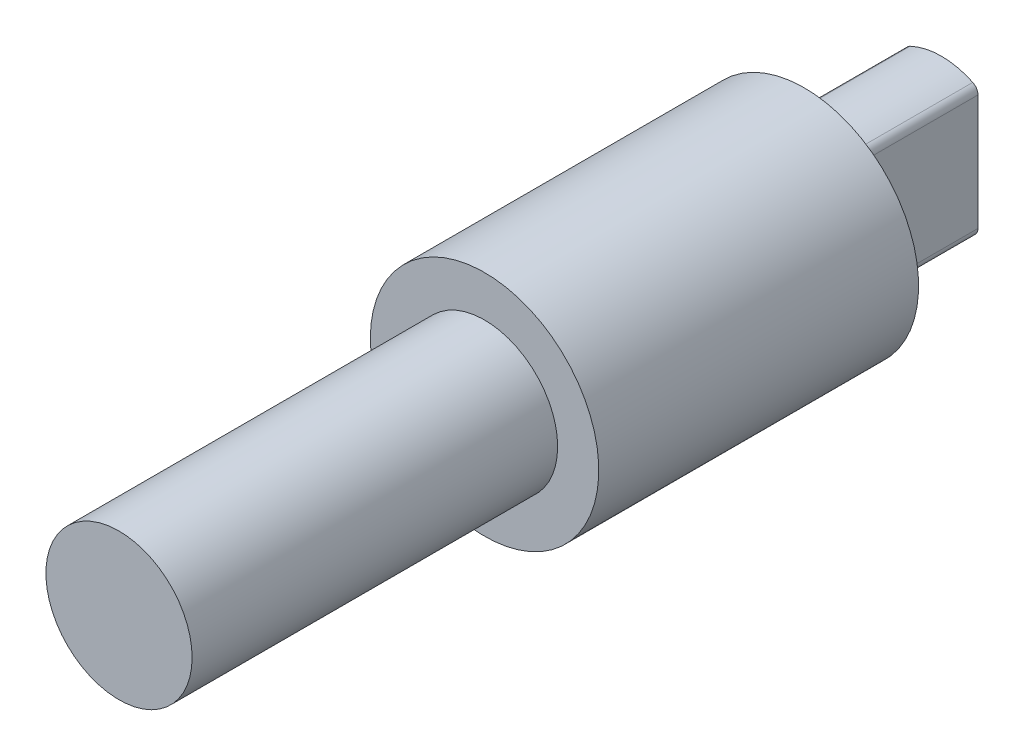
ISO-10303-21;
HEADER;
FILE_DESCRIPTION(('STEP AP214'),'2;1');
FILE_NAME('part.step','',(''),(''),'','','');
FILE_SCHEMA(('AUTOMOTIVE_DESIGN { 1 0 10303 214 1 1 1 1 }'));
ENDSEC;
DATA;
#1=APPLICATION_CONTEXT('core data for automotive mechanical design processes');
#2=APPLICATION_PROTOCOL_DEFINITION('international standard','automotive_design',2000,#1);
#3=PRODUCT_CONTEXT('',#1,'mechanical');
#4=PRODUCT('Part','Part','',(#3));
#5=PRODUCT_RELATED_PRODUCT_CATEGORY('part','',(#4));
#6=PRODUCT_DEFINITION_FORMATION('','',#4);
#7=PRODUCT_DEFINITION_CONTEXT('part definition',#1,'design');
#8=PRODUCT_DEFINITION('design','',#6,#7);
#9=PRODUCT_DEFINITION_SHAPE('','',#8);
#10=(LENGTH_UNIT() NAMED_UNIT(*) SI_UNIT(.MILLI.,.METRE.));
#11=(NAMED_UNIT(*) PLANE_ANGLE_UNIT() SI_UNIT($,.RADIAN.));
#12=(NAMED_UNIT(*) SI_UNIT($,.STERADIAN.) SOLID_ANGLE_UNIT());
#13=UNCERTAINTY_MEASURE_WITH_UNIT(LENGTH_MEASURE(1.E-05),#10,'distance_accuracy_value','');
#14=(GEOMETRIC_REPRESENTATION_CONTEXT(3) GLOBAL_UNCERTAINTY_ASSIGNED_CONTEXT((#13)) GLOBAL_UNIT_ASSIGNED_CONTEXT((#10,
#11,#12)) REPRESENTATION_CONTEXT('',''));
#15=CARTESIAN_POINT('',(0.,0.,0.));
#16=DIRECTION('',(0.,0.,1.));
#17=DIRECTION('',(1.,0.,0.));
#18=AXIS2_PLACEMENT_3D('',#15,#16,#17);
#19=CARTESIAN_POINT('',(0.,0.,-364.100348116694));
#20=DIRECTION('',(0.,0.,-1.));
#21=DIRECTION('',(-1.,0.,0.));
#22=AXIS2_PLACEMENT_3D('',#19,#20,#21);
#23=CYLINDRICAL_SURFACE('',#22,8.);
#24=CARTESIAN_POINT('',(0.,0.,-25.));
#25=DIRECTION('',(0.,0.,-1.));
#26=DIRECTION('',(-1.,0.,0.));
#27=AXIS2_PLACEMENT_3D('',#24,#25,#26);
#28=CIRCLE('',#27,8.);
#29=CARTESIAN_POINT('',(-3.42857142857143,7.22806322324201,-25.));
#30=VERTEX_POINT('',#29);
#31=CARTESIAN_POINT('',(3.42857142857142,7.22806322324201,-25.));
#32=VERTEX_POINT('',#31);
#33=EDGE_CURVE('E163',#30,#32,#28,.T.);
#34=ORIENTED_EDGE('',*,*,#33,.T.);
#35=DIRECTION('',(0.,0.,-1.));
#36=VECTOR('',#35,1.);
#37=CARTESIAN_POINT('',(3.42857142857138,7.22806322324201,-364.100348116694));
#38=LINE('',#37,#36);
#39=CARTESIAN_POINT('',(3.42857142857142,7.22806322324202,-40.));
#40=VERTEX_POINT('',#39);
#41=EDGE_CURVE('E174',#32,#40,#38,.T.);
#42=ORIENTED_EDGE('',*,*,#41,.T.);
#43=CARTESIAN_POINT('',(0.,0.,-40.));
#44=DIRECTION('',(0.,0.,-1.));
#45=DIRECTION('',(-1.,0.,0.));
#46=AXIS2_PLACEMENT_3D('',#43,#44,#45);
#47=CIRCLE('',#46,8.00000000000001);
#48=CARTESIAN_POINT('',(-3.42857142857144,7.22806322324202,-40.));
#49=VERTEX_POINT('',#48);
#50=EDGE_CURVE('E160',#49,#40,#47,.T.);
#51=ORIENTED_EDGE('',*,*,#50,.F.);
#52=DIRECTION('',(0.,0.,-1.));
#53=VECTOR('',#52,1.);
#54=CARTESIAN_POINT('',(-3.42857142857148,7.22806322324201,-364.100348116694));
#55=LINE('',#54,#53);
#56=EDGE_CURVE('E172',#49,#30,#55,.F.);
#57=ORIENTED_EDGE('',*,*,#56,.T.);
#58=EDGE_LOOP('',(#34,#42,#51,#57));
#59=FACE_BOUND('',#58,.T.);
#60=ADVANCED_FACE('F32',(#59),#23,.T.);
#61=CARTESIAN_POINT('',(0.,0.,-364.100348116694));
#62=DIRECTION('',(0.,0.,-1.));
#63=DIRECTION('',(-1.,0.,0.));
#64=AXIS2_PLACEMENT_3D('',#61,#62,#63);
#65=CYLINDRICAL_SURFACE('',#64,8.);
#66=DIRECTION('',(0.,0.,1.));
#67=VECTOR('',#66,1.);
#68=CARTESIAN_POINT('',(-7.87831834848021,1.39,10.));
#69=LINE('',#68,#67);
#70=CARTESIAN_POINT('',(-7.87831834848021,1.39,10.));
#71=VERTEX_POINT('',#70);
#72=CARTESIAN_POINT('',(-7.87831834848021,1.39,40.));
#73=VERTEX_POINT('',#72);
#74=EDGE_CURVE('E142',#71,#73,#69,.T.);
#75=ORIENTED_EDGE('',*,*,#74,.T.);
#76=CARTESIAN_POINT('',(0.,0.,40.));
#77=DIRECTION('',(0.,0.,1.));
#78=DIRECTION('',(1.,0.,0.));
#79=AXIS2_PLACEMENT_3D('',#76,#77,#78);
#80=CIRCLE('',#79,8.);
#81=CARTESIAN_POINT('',(-7.87831834848023,-1.39,40.));
#82=VERTEX_POINT('',#81);
#83=EDGE_CURVE('E123',#73,#82,#80,.T.);
#84=ORIENTED_EDGE('',*,*,#83,.T.);
#85=DIRECTION('',(0.,0.,1.));
#86=VECTOR('',#85,1.);
#87=CARTESIAN_POINT('',(-7.87831834848021,-1.39,10.));
#88=LINE('',#87,#86);
#89=CARTESIAN_POINT('',(-7.87831834848021,-1.39,10.));
#90=VERTEX_POINT('',#89);
#91=EDGE_CURVE('E139',#90,#82,#88,.T.);
#92=ORIENTED_EDGE('',*,*,#91,.F.);
#93=CARTESIAN_POINT('',(0.,0.,10.));
#94=DIRECTION('',(0.,0.,-1.));
#95=DIRECTION('',(-1.,0.,0.));
#96=AXIS2_PLACEMENT_3D('',#93,#94,#95);
#97=CIRCLE('',#96,8.);
#98=EDGE_CURVE('E170',#71,#90,#97,.T.);
#99=ORIENTED_EDGE('',*,*,#98,.F.);
#100=EDGE_LOOP('',(#75,#84,#92,#99));
#101=FACE_BOUND('',#100,.T.);
#102=CARTESIAN_POINT('',(0.,0.,50.));
#103=DIRECTION('',(0.,0.,1.));
#104=DIRECTION('',(1.,0.,0.));
#105=AXIS2_PLACEMENT_3D('',#102,#103,#104);
#106=CIRCLE('',#105,8.);
#107=CARTESIAN_POINT('',(7.99999999999999,0.,50.));
#108=VERTEX_POINT('',#107);
#109=EDGE_CURVE('E143',#108,#108,#106,.T.);
#110=ORIENTED_EDGE('',*,*,#109,.F.);
#111=EDGE_LOOP('',(#110));
#112=FACE_BOUND('',#111,.T.);
#113=ADVANCED_FACE('F136',(#101,#112),#65,.T.);
#114=CARTESIAN_POINT('',(12.5,0.,10.));
#115=DIRECTION('',(0.,0.,-1.));
#116=DIRECTION('',(-1.,0.,0.));
#117=AXIS2_PLACEMENT_3D('',#114,#115,#116);
#118=PLANE('',#117);
#119=CARTESIAN_POINT('',(0.,0.,10.));
#120=DIRECTION('',(0.,0.,-1.));
#121=DIRECTION('',(-1.,0.,0.));
#122=AXIS2_PLACEMENT_3D('',#119,#120,#121);
#123=CIRCLE('',#122,12.5);
#124=CARTESIAN_POINT('',(-12.5,0.,10.));
#125=VERTEX_POINT('',#124);
#126=EDGE_CURVE('E167',#125,#125,#123,.T.);
#127=ORIENTED_EDGE('',*,*,#126,.F.);
#128=EDGE_LOOP('',(#127));
#129=FACE_BOUND('',#128,.T.);
#130=ORIENTED_EDGE('',*,*,#98,.T.);
#131=DIRECTION('',(1.,0.,0.));
#132=VECTOR('',#131,1.);
#133=CARTESIAN_POINT('',(-6.61,-1.39,10.));
#134=LINE('',#133,#132);
#135=CARTESIAN_POINT('',(-6.61,-1.39,10.));
#136=VERTEX_POINT('',#135);
#137=EDGE_CURVE('E148',#90,#136,#134,.T.);
#138=ORIENTED_EDGE('',*,*,#137,.T.);
#139=DIRECTION('',(0.,1.,0.));
#140=VECTOR('',#139,1.);
#141=CARTESIAN_POINT('',(-6.61,1.39,10.));
#142=LINE('',#141,#140);
#143=CARTESIAN_POINT('',(-6.61,1.39,10.));
#144=VERTEX_POINT('',#143);
#145=EDGE_CURVE('E130',#136,#144,#142,.T.);
#146=ORIENTED_EDGE('',*,*,#145,.T.);
#147=DIRECTION('',(-1.,0.,0.));
#148=VECTOR('',#147,1.);
#149=CARTESIAN_POINT('',(-6.61,1.39,10.));
#150=LINE('',#149,#148);
#151=EDGE_CURVE('E250',#144,#71,#150,.T.);
#152=ORIENTED_EDGE('',*,*,#151,.T.);
#153=EDGE_LOOP('',(#130,#138,#146,#152));
#154=FACE_BOUND('',#153,.T.);
#155=ADVANCED_FACE('F261',(#129,#154),#118,.F.);
#156=CARTESIAN_POINT('',(0.,0.,-364.100348116694));
#157=DIRECTION('',(0.,0.,-1.));
#158=DIRECTION('',(-1.,0.,0.));
#159=AXIS2_PLACEMENT_3D('',#156,#157,#158);
#160=CYLINDRICAL_SURFACE('',#159,12.5);
#161=CARTESIAN_POINT('',(0.,0.,-25.));
#162=DIRECTION('',(0.,0.,-1.));
#163=DIRECTION('',(-1.,0.,0.));
#164=AXIS2_PLACEMENT_3D('',#161,#162,#163);
#165=CIRCLE('',#164,12.5);
#166=CARTESIAN_POINT('',(-12.5,0.,-25.));
#167=VERTEX_POINT('',#166);
#168=EDGE_CURVE('E164',#167,#167,#165,.T.);
#169=ORIENTED_EDGE('',*,*,#168,.F.);
#170=EDGE_LOOP('',(#169));
#171=FACE_BOUND('',#170,.T.);
#172=ORIENTED_EDGE('',*,*,#126,.T.);
#173=EDGE_LOOP('',(#172));
#174=FACE_BOUND('',#173,.T.);
#175=ADVANCED_FACE('F263',(#171,#174),#160,.T.);
#176=CARTESIAN_POINT('',(12.5,0.,-25.));
#177=DIRECTION('',(0.,0.,1.));
#178=DIRECTION('',(1.,0.,0.));
#179=AXIS2_PLACEMENT_3D('',#176,#177,#178);
#180=PLANE('',#179);
#181=ORIENTED_EDGE('',*,*,#33,.F.);
#182=CARTESIAN_POINT('',(-3.,6.32455532033676,-25.));
#183=DIRECTION('',(0.,0.,1.));
#184=DIRECTION('',(1.,0.,0.));
#185=AXIS2_PLACEMENT_3D('',#182,#183,#184);
#186=CIRCLE('',#185,1.);
#187=CARTESIAN_POINT('',(-4.,6.32455532033676,-25.));
#188=VERTEX_POINT('',#187);
#189=EDGE_CURVE('E201',#30,#188,#186,.T.);
#190=ORIENTED_EDGE('',*,*,#189,.T.);
#191=DIRECTION('',(0.,-1.,0.));
#192=VECTOR('',#191,1.);
#193=CARTESIAN_POINT('',(-4.,6.92820323027552,-25.));
#194=LINE('',#193,#192);
#195=CARTESIAN_POINT('',(-4.,-6.32455532033676,-25.));
#196=VERTEX_POINT('',#195);
#197=EDGE_CURVE('E207',#188,#196,#194,.T.);
#198=ORIENTED_EDGE('',*,*,#197,.T.);
#199=CARTESIAN_POINT('',(-3.,-6.32455532033676,-25.));
#200=DIRECTION('',(0.,0.,1.));
#201=DIRECTION('',(1.,0.,0.));
#202=AXIS2_PLACEMENT_3D('',#199,#200,#201);
#203=CIRCLE('',#202,1.);
#204=CARTESIAN_POINT('',(-3.42857142857143,-7.22806322324201,-25.));
#205=VERTEX_POINT('',#204);
#206=EDGE_CURVE('E40',#196,#205,#203,.T.);
#207=ORIENTED_EDGE('',*,*,#206,.T.);
#208=CARTESIAN_POINT('',(3.42857142857142,-7.22806322324201,-25.));
#209=VERTEX_POINT('',#208);
#210=EDGE_CURVE('E161',#209,#205,#28,.T.);
#211=ORIENTED_EDGE('',*,*,#210,.F.);
#212=CARTESIAN_POINT('',(3.,-6.32455532033676,-25.));
#213=DIRECTION('',(0.,0.,1.));
#214=DIRECTION('',(1.,0.,0.));
#215=AXIS2_PLACEMENT_3D('',#212,#213,#214);
#216=CIRCLE('',#215,1.);
#217=CARTESIAN_POINT('',(4.,-6.32455532033676,-25.));
#218=VERTEX_POINT('',#217);
#219=EDGE_CURVE('E11',#209,#218,#216,.T.);
#220=ORIENTED_EDGE('',*,*,#219,.T.);
#221=DIRECTION('',(0.,1.,0.));
#222=VECTOR('',#221,1.);
#223=CARTESIAN_POINT('',(4.,6.92820323027551,-25.));
#224=LINE('',#223,#222);
#225=CARTESIAN_POINT('',(4.,6.32455532033676,-25.));
#226=VERTEX_POINT('',#225);
#227=EDGE_CURVE('E144',#218,#226,#224,.T.);
#228=ORIENTED_EDGE('',*,*,#227,.T.);
#229=CARTESIAN_POINT('',(3.,6.32455532033676,-25.));
#230=DIRECTION('',(0.,0.,1.));
#231=DIRECTION('',(1.,0.,0.));
#232=AXIS2_PLACEMENT_3D('',#229,#230,#231);
#233=CIRCLE('',#232,1.);
#234=EDGE_CURVE('E199',#226,#32,#233,.T.);
#235=ORIENTED_EDGE('',*,*,#234,.T.);
#236=EDGE_LOOP('',(#181,#190,#198,#207,#211,#220,#228,#235));
#237=FACE_BOUND('',#236,.T.);
#238=ORIENTED_EDGE('',*,*,#168,.T.);
#239=EDGE_LOOP('',(#238));
#240=FACE_BOUND('',#239,.T.);
#241=ADVANCED_FACE('F205',(#237,#240),#180,.F.);
#242=ORIENTED_EDGE('',*,*,#210,.T.);
#243=DIRECTION('',(0.,0.,-1.));
#244=VECTOR('',#243,1.);
#245=CARTESIAN_POINT('',(-3.42857142857148,-7.22806322324201,-364.100348116694));
#246=LINE('',#245,#244);
#247=CARTESIAN_POINT('',(-3.42857142857144,-7.22806322324202,-40.));
#248=VERTEX_POINT('',#247);
#249=EDGE_CURVE('E196',#205,#248,#246,.T.);
#250=ORIENTED_EDGE('',*,*,#249,.T.);
#251=CARTESIAN_POINT('',(3.42857142857142,-7.22806322324202,-40.));
#252=VERTEX_POINT('',#251);
#253=EDGE_CURVE('E151',#252,#248,#47,.T.);
#254=ORIENTED_EDGE('',*,*,#253,.F.);
#255=DIRECTION('',(0.,0.,-1.));
#256=VECTOR('',#255,1.);
#257=CARTESIAN_POINT('',(3.42857142857138,-7.22806322324201,-364.100348116694));
#258=LINE('',#257,#256);
#259=EDGE_CURVE('E53',#252,#209,#258,.F.);
#260=ORIENTED_EDGE('',*,*,#259,.T.);
#261=EDGE_LOOP('',(#242,#250,#254,#260));
#262=FACE_BOUND('',#261,.T.);
#263=ADVANCED_FACE('F276',(#262),#23,.T.);
#264=CARTESIAN_POINT('',(8.,0.,-40.));
#265=DIRECTION('',(0.,0.,1.));
#266=DIRECTION('',(1.,0.,0.));
#267=AXIS2_PLACEMENT_3D('',#264,#265,#266);
#268=PLANE('',#267);
#269=ORIENTED_EDGE('',*,*,#50,.T.);
#270=CARTESIAN_POINT('',(2.99999999999999,6.32455532033676,-40.));
#271=DIRECTION('',(0.,0.,1.));
#272=DIRECTION('',(1.,0.,0.));
#273=AXIS2_PLACEMENT_3D('',#270,#271,#272);
#274=CIRCLE('',#273,1.);
#275=CARTESIAN_POINT('',(3.99999999999999,6.32455532033676,-40.));
#276=VERTEX_POINT('',#275);
#277=EDGE_CURVE('E183',#40,#276,#274,.F.);
#278=ORIENTED_EDGE('',*,*,#277,.T.);
#279=DIRECTION('',(0.,1.,0.));
#280=VECTOR('',#279,1.);
#281=CARTESIAN_POINT('',(3.99999999999999,6.92820323027551,-40.));
#282=LINE('',#281,#280);
#283=CARTESIAN_POINT('',(3.99999999999999,-6.32455532033676,-40.));
#284=VERTEX_POINT('',#283);
#285=EDGE_CURVE('E217',#284,#276,#282,.T.);
#286=ORIENTED_EDGE('',*,*,#285,.F.);
#287=CARTESIAN_POINT('',(2.99999999999999,-6.32455532033676,-40.));
#288=DIRECTION('',(0.,0.,1.));
#289=DIRECTION('',(1.,0.,0.));
#290=AXIS2_PLACEMENT_3D('',#287,#288,#289);
#291=CIRCLE('',#290,1.);
#292=EDGE_CURVE('E177',#284,#252,#291,.F.);
#293=ORIENTED_EDGE('',*,*,#292,.T.);
#294=ORIENTED_EDGE('',*,*,#253,.T.);
#295=CARTESIAN_POINT('',(-3.00000000000001,-6.32455532033676,-40.));
#296=DIRECTION('',(0.,0.,1.));
#297=DIRECTION('',(1.,0.,0.));
#298=AXIS2_PLACEMENT_3D('',#295,#296,#297);
#299=CIRCLE('',#298,1.);
#300=CARTESIAN_POINT('',(-4.00000000000001,-6.32455532033676,-40.));
#301=VERTEX_POINT('',#300);
#302=EDGE_CURVE('E179',#248,#301,#299,.F.);
#303=ORIENTED_EDGE('',*,*,#302,.T.);
#304=DIRECTION('',(0.,-1.,0.));
#305=VECTOR('',#304,1.);
#306=CARTESIAN_POINT('',(-4.00000000000001,6.92820323027552,-40.));
#307=LINE('',#306,#305);
#308=CARTESIAN_POINT('',(-4.00000000000001,6.32455532033676,-40.));
#309=VERTEX_POINT('',#308);
#310=EDGE_CURVE('E218',#309,#301,#307,.T.);
#311=ORIENTED_EDGE('',*,*,#310,.F.);
#312=CARTESIAN_POINT('',(-3.00000000000001,6.32455532033676,-40.));
#313=DIRECTION('',(0.,0.,1.));
#314=DIRECTION('',(1.,0.,0.));
#315=AXIS2_PLACEMENT_3D('',#312,#313,#314);
#316=CIRCLE('',#315,1.);
#317=EDGE_CURVE('E181',#309,#49,#316,.F.);
#318=ORIENTED_EDGE('',*,*,#317,.T.);
#319=EDGE_LOOP('',(#269,#278,#286,#293,#294,#303,#311,#318));
#320=FACE_BOUND('',#319,.T.);
#321=ADVANCED_FACE('F224',(#320),#268,.F.);
#322=CARTESIAN_POINT('',(-6.61,1.39,10.));
#323=DIRECTION('',(1.,0.,0.));
#324=DIRECTION('',(0.,0.,-1.));
#325=AXIS2_PLACEMENT_3D('',#322,#323,#324);
#326=PLANE('',#325);
#327=DIRECTION('',(0.,1.,0.));
#328=VECTOR('',#327,1.);
#329=CARTESIAN_POINT('',(-6.61,1.39,40.));
#330=LINE('',#329,#328);
#331=CARTESIAN_POINT('',(-6.61,-1.39,40.));
#332=VERTEX_POINT('',#331);
#333=CARTESIAN_POINT('',(-6.61,1.39,40.));
#334=VERTEX_POINT('',#333);
#335=EDGE_CURVE('E126',#332,#334,#330,.T.);
#336=ORIENTED_EDGE('',*,*,#335,.T.);
#337=DIRECTION('',(0.,0.,1.));
#338=VECTOR('',#337,1.);
#339=CARTESIAN_POINT('',(-6.61,1.39,10.));
#340=LINE('',#339,#338);
#341=EDGE_CURVE('E153',#144,#334,#340,.T.);
#342=ORIENTED_EDGE('',*,*,#341,.F.);
#343=ORIENTED_EDGE('',*,*,#145,.F.);
#344=DIRECTION('',(0.,0.,1.));
#345=VECTOR('',#344,1.);
#346=CARTESIAN_POINT('',(-6.61,-1.39,10.));
#347=LINE('',#346,#345);
#348=EDGE_CURVE('E149',#136,#332,#347,.T.);
#349=ORIENTED_EDGE('',*,*,#348,.T.);
#350=EDGE_LOOP('',(#336,#342,#343,#349));
#351=FACE_BOUND('',#350,.T.);
#352=ADVANCED_FACE('F259',(#351),#326,.F.);
#353=CARTESIAN_POINT('',(-6.61,-1.39,10.));
#354=DIRECTION('',(0.,-1.,0.));
#355=DIRECTION('',(1.,0.,0.));
#356=AXIS2_PLACEMENT_3D('',#353,#354,#355);
#357=PLANE('',#356);
#358=DIRECTION('',(1.,0.,0.));
#359=VECTOR('',#358,1.);
#360=CARTESIAN_POINT('',(-6.61,-1.39,40.));
#361=LINE('',#360,#359);
#362=EDGE_CURVE('E120',#82,#332,#361,.T.);
#363=ORIENTED_EDGE('',*,*,#362,.T.);
#364=ORIENTED_EDGE('',*,*,#348,.F.);
#365=ORIENTED_EDGE('',*,*,#137,.F.);
#366=ORIENTED_EDGE('',*,*,#91,.T.);
#367=EDGE_LOOP('',(#363,#364,#365,#366));
#368=FACE_BOUND('',#367,.T.);
#369=ADVANCED_FACE('F146',(#368),#357,.F.);
#370=CARTESIAN_POINT('',(-6.61,1.39,10.));
#371=DIRECTION('',(0.,1.,0.));
#372=DIRECTION('',(-1.,0.,0.));
#373=AXIS2_PLACEMENT_3D('',#370,#371,#372);
#374=PLANE('',#373);
#375=DIRECTION('',(-1.,0.,0.));
#376=VECTOR('',#375,1.);
#377=CARTESIAN_POINT('',(-6.61,1.39,40.));
#378=LINE('',#377,#376);
#379=EDGE_CURVE('E131',#334,#73,#378,.T.);
#380=ORIENTED_EDGE('',*,*,#379,.T.);
#381=ORIENTED_EDGE('',*,*,#74,.F.);
#382=ORIENTED_EDGE('',*,*,#151,.F.);
#383=ORIENTED_EDGE('',*,*,#341,.T.);
#384=EDGE_LOOP('',(#380,#381,#382,#383));
#385=FACE_BOUND('',#384,.T.);
#386=ADVANCED_FACE('F255',(#385),#374,.F.);
#387=CARTESIAN_POINT('',(0.,0.,50.));
#388=DIRECTION('',(0.,0.,1.));
#389=DIRECTION('',(1.,0.,0.));
#390=AXIS2_PLACEMENT_3D('',#387,#388,#389);
#391=PLANE('',#390);
#392=ORIENTED_EDGE('',*,*,#109,.T.);
#393=EDGE_LOOP('',(#392));
#394=FACE_BOUND('',#393,.T.);
#395=ADVANCED_FACE('F317',(#394),#391,.T.);
#396=CARTESIAN_POINT('',(0.,0.,40.));
#397=DIRECTION('',(0.,0.,1.));
#398=DIRECTION('',(1.,0.,0.));
#399=AXIS2_PLACEMENT_3D('',#396,#397,#398);
#400=PLANE('',#399);
#401=ORIENTED_EDGE('',*,*,#362,.F.);
#402=ORIENTED_EDGE('',*,*,#83,.F.);
#403=ORIENTED_EDGE('',*,*,#379,.F.);
#404=ORIENTED_EDGE('',*,*,#335,.F.);
#405=EDGE_LOOP('',(#401,#402,#403,#404));
#406=FACE_BOUND('',#405,.T.);
#407=ADVANCED_FACE('F122',(#406),#400,.F.);
#408=CARTESIAN_POINT('',(-4.,6.92820323027552,-10.577794898144));
#409=DIRECTION('',(1.,0.,0.));
#410=DIRECTION('',(0.,0.,-1.));
#411=AXIS2_PLACEMENT_3D('',#408,#409,#410);
#412=PLANE('',#411);
#413=CARTESIAN_POINT('',(-4.00000000000001,0.,-32.5));
#414=DIRECTION('',(-1.,0.,0.));
#415=DIRECTION('',(0.,0.,1.));
#416=AXIS2_PLACEMENT_3D('',#413,#414,#415);
#417=CIRCLE('',#416,2.5);
#418=CARTESIAN_POINT('',(-4.00000000000001,0.,-30.));
#419=VERTEX_POINT('',#418);
#420=EDGE_CURVE('E241',#419,#419,#417,.T.);
#421=ORIENTED_EDGE('',*,*,#420,.F.);
#422=EDGE_LOOP('',(#421));
#423=FACE_BOUND('',#422,.T.);
#424=ORIENTED_EDGE('',*,*,#197,.F.);
#425=DIRECTION('',(0.,0.,-1.));
#426=VECTOR('',#425,1.);
#427=CARTESIAN_POINT('',(-4.,6.32455532033676,-10.577794898144));
#428=LINE('',#427,#426);
#429=EDGE_CURVE('E192',#188,#309,#428,.T.);
#430=ORIENTED_EDGE('',*,*,#429,.T.);
#431=ORIENTED_EDGE('',*,*,#310,.T.);
#432=DIRECTION('',(0.,0.,-1.));
#433=VECTOR('',#432,1.);
#434=CARTESIAN_POINT('',(-4.,-6.32455532033676,-10.577794898144));
#435=LINE('',#434,#433);
#436=EDGE_CURVE('E190',#301,#196,#435,.F.);
#437=ORIENTED_EDGE('',*,*,#436,.T.);
#438=EDGE_LOOP('',(#424,#430,#431,#437));
#439=FACE_BOUND('',#438,.T.);
#440=ADVANCED_FACE('F213',(#423,#439),#412,.F.);
#441=CARTESIAN_POINT('',(4.,6.92820323027551,-10.577794898144));
#442=DIRECTION('',(-1.,0.,0.));
#443=DIRECTION('',(0.,0.,1.));
#444=AXIS2_PLACEMENT_3D('',#441,#442,#443);
#445=PLANE('',#444);
#446=ORIENTED_EDGE('',*,*,#285,.T.);
#447=DIRECTION('',(0.,0.,-1.));
#448=VECTOR('',#447,1.);
#449=CARTESIAN_POINT('',(4.,6.32455532033676,-10.577794898144));
#450=LINE('',#449,#448);
#451=EDGE_CURVE('E188',#276,#226,#450,.F.);
#452=ORIENTED_EDGE('',*,*,#451,.T.);
#453=ORIENTED_EDGE('',*,*,#227,.F.);
#454=DIRECTION('',(0.,0.,-1.));
#455=VECTOR('',#454,1.);
#456=CARTESIAN_POINT('',(4.,-6.32455532033676,-10.577794898144));
#457=LINE('',#456,#455);
#458=EDGE_CURVE('E185',#218,#284,#457,.T.);
#459=ORIENTED_EDGE('',*,*,#458,.T.);
#460=EDGE_LOOP('',(#446,#452,#453,#459));
#461=FACE_BOUND('',#460,.T.);
#462=ADVANCED_FACE('F234',(#461),#445,.F.);
#463=CARTESIAN_POINT('',(2.99999999999995,6.32455532033676,-364.100348116694));
#464=DIRECTION('',(0.,0.,-1.));
#465=DIRECTION('',(-1.,0.,0.));
#466=AXIS2_PLACEMENT_3D('',#463,#464,#465);
#467=CYLINDRICAL_SURFACE('',#466,1.);
#468=ORIENTED_EDGE('',*,*,#234,.F.);
#469=ORIENTED_EDGE('',*,*,#451,.F.);
#470=ORIENTED_EDGE('',*,*,#277,.F.);
#471=ORIENTED_EDGE('',*,*,#41,.F.);
#472=EDGE_LOOP('',(#468,#469,#470,#471));
#473=FACE_BOUND('',#472,.T.);
#474=ADVANCED_FACE('F229',(#473),#467,.T.);
#475=CARTESIAN_POINT('',(-3.00000000000005,6.32455532033676,-364.100348116694));
#476=DIRECTION('',(0.,0.,-1.));
#477=DIRECTION('',(-1.,0.,0.));
#478=AXIS2_PLACEMENT_3D('',#475,#476,#477);
#479=CYLINDRICAL_SURFACE('',#478,1.);
#480=ORIENTED_EDGE('',*,*,#189,.F.);
#481=ORIENTED_EDGE('',*,*,#56,.F.);
#482=ORIENTED_EDGE('',*,*,#317,.F.);
#483=ORIENTED_EDGE('',*,*,#429,.F.);
#484=EDGE_LOOP('',(#480,#481,#482,#483));
#485=FACE_BOUND('',#484,.T.);
#486=ADVANCED_FACE('F220',(#485),#479,.T.);
#487=CARTESIAN_POINT('',(-3.00000000000005,-6.32455532033676,-364.100348116694));
#488=DIRECTION('',(0.,0.,-1.));
#489=DIRECTION('',(-1.,0.,0.));
#490=AXIS2_PLACEMENT_3D('',#487,#488,#489);
#491=CYLINDRICAL_SURFACE('',#490,1.);
#492=ORIENTED_EDGE('',*,*,#206,.F.);
#493=ORIENTED_EDGE('',*,*,#436,.F.);
#494=ORIENTED_EDGE('',*,*,#302,.F.);
#495=ORIENTED_EDGE('',*,*,#249,.F.);
#496=EDGE_LOOP('',(#492,#493,#494,#495));
#497=FACE_BOUND('',#496,.T.);
#498=ADVANCED_FACE('F289',(#497),#491,.T.);
#499=CARTESIAN_POINT('',(2.99999999999995,-6.32455532033676,-364.100348116694));
#500=DIRECTION('',(0.,0.,-1.));
#501=DIRECTION('',(-1.,0.,0.));
#502=AXIS2_PLACEMENT_3D('',#499,#500,#501);
#503=CYLINDRICAL_SURFACE('',#502,1.);
#504=ORIENTED_EDGE('',*,*,#219,.F.);
#505=ORIENTED_EDGE('',*,*,#259,.F.);
#506=ORIENTED_EDGE('',*,*,#292,.F.);
#507=ORIENTED_EDGE('',*,*,#458,.F.);
#508=EDGE_LOOP('',(#504,#505,#506,#507));
#509=FACE_BOUND('',#508,.T.);
#510=ADVANCED_FACE('F34',(#509),#503,.T.);
#511=CARTESIAN_POINT('',(-3.00000000000001,0.,-32.5));
#512=DIRECTION('',(-1.,0.,0.));
#513=DIRECTION('',(0.,0.,1.));
#514=AXIS2_PLACEMENT_3D('',#511,#512,#513);
#515=CYLINDRICAL_SURFACE('',#514,2.5);
#516=CARTESIAN_POINT('',(-3.00000000000001,0.,-32.5));
#517=DIRECTION('',(-1.,0.,0.));
#518=DIRECTION('',(0.,0.,1.));
#519=AXIS2_PLACEMENT_3D('',#516,#517,#518);
#520=CIRCLE('',#519,2.5);
#521=CARTESIAN_POINT('',(-3.00000000000001,0.,-30.));
#522=VERTEX_POINT('',#521);
#523=EDGE_CURVE('E244',#522,#522,#520,.T.);
#524=ORIENTED_EDGE('',*,*,#523,.F.);
#525=EDGE_LOOP('',(#524));
#526=FACE_BOUND('',#525,.T.);
#527=ORIENTED_EDGE('',*,*,#420,.T.);
#528=EDGE_LOOP('',(#527));
#529=FACE_BOUND('',#528,.T.);
#530=ADVANCED_FACE('F292',(#526,#529),#515,.F.);
#531=CARTESIAN_POINT('',(-3.00000000000001,0.,-32.5));
#532=DIRECTION('',(-1.,0.,0.));
#533=DIRECTION('',(0.,0.,1.));
#534=AXIS2_PLACEMENT_3D('',#531,#532,#533);
#535=PLANE('',#534);
#536=ORIENTED_EDGE('',*,*,#523,.T.);
#537=EDGE_LOOP('',(#536));
#538=FACE_BOUND('',#537,.T.);
#539=ADVANCED_FACE('F297',(#538),#535,.T.);
#540=CLOSED_SHELL('',(#60,#113,#155,#175,#241,#263,#321,#352,#369,#386,#395,#407,#440,#462,#474,
#486,#498,#510,#530,#539));
#541=MANIFOLD_SOLID_BREP('B2',#540);
#542=ADVANCED_BREP_SHAPE_REPRESENTATION('',(#18,#541),#14);
#543=SHAPE_DEFINITION_REPRESENTATION(#9,#542);
ENDSEC;
END-ISO-10303-21;
